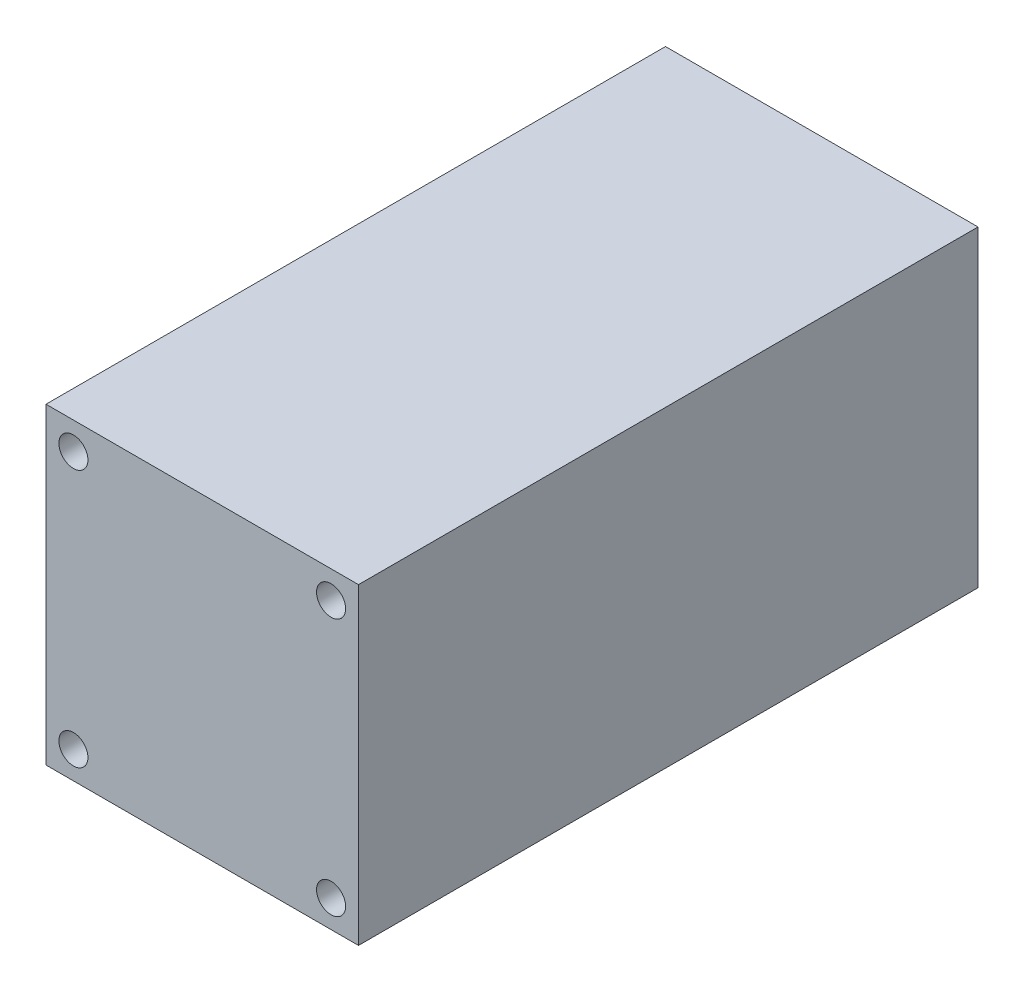
ISO-10303-21;
HEADER;
FILE_DESCRIPTION(('STEP AP214'),'2;1');
FILE_NAME('part.step','',(''),(''),'','','');
FILE_SCHEMA(('AUTOMOTIVE_DESIGN { 1 0 10303 214 1 1 1 1 }'));
ENDSEC;
DATA;
#1=APPLICATION_CONTEXT('core data for automotive mechanical design processes');
#2=APPLICATION_PROTOCOL_DEFINITION('international standard','automotive_design',2000,#1);
#3=PRODUCT_CONTEXT('',#1,'mechanical');
#4=PRODUCT('Part','Part','',(#3));
#5=PRODUCT_RELATED_PRODUCT_CATEGORY('part','',(#4));
#6=PRODUCT_DEFINITION_FORMATION('','',#4);
#7=PRODUCT_DEFINITION_CONTEXT('part definition',#1,'design');
#8=PRODUCT_DEFINITION('design','',#6,#7);
#9=PRODUCT_DEFINITION_SHAPE('','',#8);
#10=(LENGTH_UNIT() NAMED_UNIT(*) SI_UNIT(.MILLI.,.METRE.));
#11=(NAMED_UNIT(*) PLANE_ANGLE_UNIT() SI_UNIT($,.RADIAN.));
#12=(NAMED_UNIT(*) SI_UNIT($,.STERADIAN.) SOLID_ANGLE_UNIT());
#13=UNCERTAINTY_MEASURE_WITH_UNIT(LENGTH_MEASURE(1.E-05),#10,'distance_accuracy_value','');
#14=(GEOMETRIC_REPRESENTATION_CONTEXT(3) GLOBAL_UNCERTAINTY_ASSIGNED_CONTEXT((#13)) GLOBAL_UNIT_ASSIGNED_CONTEXT((#10,
#11,#12)) REPRESENTATION_CONTEXT('',''));
#15=CARTESIAN_POINT('',(0.,0.,0.));
#16=DIRECTION('',(0.,0.,1.));
#17=DIRECTION('',(1.,0.,0.));
#18=AXIS2_PLACEMENT_3D('',#15,#16,#17);
#19=CARTESIAN_POINT('',(0.,0.,113.));
#20=DIRECTION('',(0.,0.,-1.));
#21=DIRECTION('',(-1.,0.,0.));
#22=AXIS2_PLACEMENT_3D('',#19,#20,#21);
#23=PLANE('',#22);
#24=CARTESIAN_POINT('',(23.5,-23.5,113.));
#25=DIRECTION('',(0.,0.,1.));
#26=DIRECTION('',(1.,0.,0.));
#27=AXIS2_PLACEMENT_3D('',#24,#25,#26);
#28=CIRCLE('',#27,2.65);
#29=CARTESIAN_POINT('',(26.15,-23.5,113.));
#30=VERTEX_POINT('',#29);
#31=EDGE_CURVE('E134',#30,#30,#28,.T.);
#32=ORIENTED_EDGE('',*,*,#31,.F.);
#33=EDGE_LOOP('',(#32));
#34=FACE_BOUND('',#33,.T.);
#35=CARTESIAN_POINT('',(-23.5,23.5,113.));
#36=DIRECTION('',(0.,0.,1.));
#37=DIRECTION('',(1.,0.,0.));
#38=AXIS2_PLACEMENT_3D('',#35,#36,#37);
#39=CIRCLE('',#38,2.65);
#40=CARTESIAN_POINT('',(-20.85,23.5,113.));
#41=VERTEX_POINT('',#40);
#42=EDGE_CURVE('E103',#41,#41,#39,.T.);
#43=ORIENTED_EDGE('',*,*,#42,.F.);
#44=EDGE_LOOP('',(#43));
#45=FACE_BOUND('',#44,.T.);
#46=DIRECTION('',(0.,1.,0.));
#47=VECTOR('',#46,1.);
#48=CARTESIAN_POINT('',(28.5,-28.5,113.));
#49=LINE('',#48,#47);
#50=CARTESIAN_POINT('',(28.5,-28.5,113.));
#51=VERTEX_POINT('',#50);
#52=CARTESIAN_POINT('',(28.5,28.5,113.));
#53=VERTEX_POINT('',#52);
#54=EDGE_CURVE('E86',#51,#53,#49,.T.);
#55=ORIENTED_EDGE('',*,*,#54,.T.);
#56=DIRECTION('',(-1.,0.,0.));
#57=VECTOR('',#56,1.);
#58=CARTESIAN_POINT('',(-28.5,28.5,113.));
#59=LINE('',#58,#57);
#60=CARTESIAN_POINT('',(-28.5,28.5,113.));
#61=VERTEX_POINT('',#60);
#62=EDGE_CURVE('E81',#53,#61,#59,.T.);
#63=ORIENTED_EDGE('',*,*,#62,.T.);
#64=DIRECTION('',(0.,-1.,0.));
#65=VECTOR('',#64,1.);
#66=CARTESIAN_POINT('',(-28.5,-28.5,113.));
#67=LINE('',#66,#65);
#68=CARTESIAN_POINT('',(-28.5,-28.5,113.));
#69=VERTEX_POINT('',#68);
#70=EDGE_CURVE('E84',#61,#69,#67,.T.);
#71=ORIENTED_EDGE('',*,*,#70,.T.);
#72=DIRECTION('',(1.,0.,0.));
#73=VECTOR('',#72,1.);
#74=CARTESIAN_POINT('',(-28.5,-28.5,113.));
#75=LINE('',#74,#73);
#76=EDGE_CURVE('E50',#69,#51,#75,.T.);
#77=ORIENTED_EDGE('',*,*,#76,.T.);
#78=EDGE_LOOP('',(#55,#63,#71,#77));
#79=FACE_BOUND('',#78,.T.);
#80=CARTESIAN_POINT('',(23.5,23.5,113.));
#81=DIRECTION('',(0.,0.,1.));
#82=DIRECTION('',(1.,0.,0.));
#83=AXIS2_PLACEMENT_3D('',#80,#81,#82);
#84=CIRCLE('',#83,2.65);
#85=CARTESIAN_POINT('',(26.15,23.5,113.));
#86=VERTEX_POINT('',#85);
#87=EDGE_CURVE('E139',#86,#86,#84,.T.);
#88=ORIENTED_EDGE('',*,*,#87,.F.);
#89=EDGE_LOOP('',(#88));
#90=FACE_BOUND('',#89,.T.);
#91=CARTESIAN_POINT('',(-23.5,-23.5,113.));
#92=DIRECTION('',(0.,0.,1.));
#93=DIRECTION('',(1.,0.,0.));
#94=AXIS2_PLACEMENT_3D('',#91,#92,#93);
#95=CIRCLE('',#94,2.65);
#96=CARTESIAN_POINT('',(-20.85,-23.5,113.));
#97=VERTEX_POINT('',#96);
#98=EDGE_CURVE('E125',#97,#97,#95,.T.);
#99=ORIENTED_EDGE('',*,*,#98,.F.);
#100=EDGE_LOOP('',(#99));
#101=FACE_BOUND('',#100,.T.);
#102=ADVANCED_FACE('F32',(#34,#45,#79,#90,#101),#23,.F.);
#103=CARTESIAN_POINT('',(0.,0.,0.));
#104=DIRECTION('',(0.,0.,-1.));
#105=DIRECTION('',(-1.,0.,0.));
#106=AXIS2_PLACEMENT_3D('',#103,#104,#105);
#107=PLANE('',#106);
#108=CARTESIAN_POINT('',(0.,0.,0.));
#109=DIRECTION('',(0.,0.,-1.));
#110=DIRECTION('',(-1.,0.,0.));
#111=AXIS2_PLACEMENT_3D('',#108,#109,#110);
#112=CIRCLE('',#111,19.075);
#113=CARTESIAN_POINT('',(-19.075,0.,0.));
#114=VERTEX_POINT('',#113);
#115=EDGE_CURVE('E11',#114,#114,#112,.T.);
#116=ORIENTED_EDGE('',*,*,#115,.F.);
#117=EDGE_LOOP('',(#116));
#118=FACE_BOUND('',#117,.T.);
#119=CARTESIAN_POINT('',(23.5,-23.5,0.));
#120=DIRECTION('',(0.,0.,1.));
#121=DIRECTION('',(1.,0.,0.));
#122=AXIS2_PLACEMENT_3D('',#119,#120,#121);
#123=CIRCLE('',#122,2.65);
#124=CARTESIAN_POINT('',(26.15,-23.5,0.));
#125=VERTEX_POINT('',#124);
#126=EDGE_CURVE('E129',#125,#125,#123,.T.);
#127=ORIENTED_EDGE('',*,*,#126,.T.);
#128=EDGE_LOOP('',(#127));
#129=FACE_BOUND('',#128,.T.);
#130=CARTESIAN_POINT('',(-23.5,23.5,0.));
#131=DIRECTION('',(0.,0.,1.));
#132=DIRECTION('',(1.,0.,0.));
#133=AXIS2_PLACEMENT_3D('',#130,#131,#132);
#134=CIRCLE('',#133,2.65);
#135=CARTESIAN_POINT('',(-20.85,23.5,0.));
#136=VERTEX_POINT('',#135);
#137=EDGE_CURVE('E142',#136,#136,#134,.T.);
#138=ORIENTED_EDGE('',*,*,#137,.T.);
#139=EDGE_LOOP('',(#138));
#140=FACE_BOUND('',#139,.T.);
#141=DIRECTION('',(0.,1.,0.));
#142=VECTOR('',#141,1.);
#143=CARTESIAN_POINT('',(28.5,-28.5,0.));
#144=LINE('',#143,#142);
#145=CARTESIAN_POINT('',(28.5,-28.5,0.));
#146=VERTEX_POINT('',#145);
#147=CARTESIAN_POINT('',(28.5,28.5,0.));
#148=VERTEX_POINT('',#147);
#149=EDGE_CURVE('E100',#146,#148,#144,.T.);
#150=ORIENTED_EDGE('',*,*,#149,.F.);
#151=DIRECTION('',(1.,0.,0.));
#152=VECTOR('',#151,1.);
#153=CARTESIAN_POINT('',(-28.5,-28.5,0.));
#154=LINE('',#153,#152);
#155=CARTESIAN_POINT('',(-28.5,-28.5,0.));
#156=VERTEX_POINT('',#155);
#157=EDGE_CURVE('E73',#156,#146,#154,.T.);
#158=ORIENTED_EDGE('',*,*,#157,.F.);
#159=DIRECTION('',(0.,-1.,0.));
#160=VECTOR('',#159,1.);
#161=CARTESIAN_POINT('',(-28.5,-28.5,0.));
#162=LINE('',#161,#160);
#163=CARTESIAN_POINT('',(-28.5,28.5,0.));
#164=VERTEX_POINT('',#163);
#165=EDGE_CURVE('E67',#164,#156,#162,.T.);
#166=ORIENTED_EDGE('',*,*,#165,.F.);
#167=DIRECTION('',(-1.,0.,0.));
#168=VECTOR('',#167,1.);
#169=CARTESIAN_POINT('',(-28.5,28.5,0.));
#170=LINE('',#169,#168);
#171=EDGE_CURVE('E91',#148,#164,#170,.T.);
#172=ORIENTED_EDGE('',*,*,#171,.F.);
#173=EDGE_LOOP('',(#150,#158,#166,#172));
#174=FACE_BOUND('',#173,.T.);
#175=CARTESIAN_POINT('',(23.5,23.5,0.));
#176=DIRECTION('',(0.,0.,1.));
#177=DIRECTION('',(1.,0.,0.));
#178=AXIS2_PLACEMENT_3D('',#175,#176,#177);
#179=CIRCLE('',#178,2.65);
#180=CARTESIAN_POINT('',(26.15,23.5,0.));
#181=VERTEX_POINT('',#180);
#182=EDGE_CURVE('E120',#181,#181,#179,.T.);
#183=ORIENTED_EDGE('',*,*,#182,.T.);
#184=EDGE_LOOP('',(#183));
#185=FACE_BOUND('',#184,.T.);
#186=CARTESIAN_POINT('',(-23.5,-23.5,0.));
#187=DIRECTION('',(0.,0.,1.));
#188=DIRECTION('',(1.,0.,0.));
#189=AXIS2_PLACEMENT_3D('',#186,#187,#188);
#190=CIRCLE('',#189,2.65);
#191=CARTESIAN_POINT('',(-20.85,-23.5,0.));
#192=VERTEX_POINT('',#191);
#193=EDGE_CURVE('E123',#192,#192,#190,.T.);
#194=ORIENTED_EDGE('',*,*,#193,.T.);
#195=EDGE_LOOP('',(#194));
#196=FACE_BOUND('',#195,.T.);
#197=ADVANCED_FACE('F112',(#118,#129,#140,#174,#185,#196),#107,.T.);
#198=CARTESIAN_POINT('',(28.5,-28.5,113.));
#199=DIRECTION('',(-1.,0.,0.));
#200=DIRECTION('',(0.,0.,1.));
#201=AXIS2_PLACEMENT_3D('',#198,#199,#200);
#202=PLANE('',#201);
#203=ORIENTED_EDGE('',*,*,#149,.T.);
#204=DIRECTION('',(0.,0.,-1.));
#205=VECTOR('',#204,1.);
#206=CARTESIAN_POINT('',(28.5,28.5,113.));
#207=LINE('',#206,#205);
#208=EDGE_CURVE('E42',#53,#148,#207,.T.);
#209=ORIENTED_EDGE('',*,*,#208,.F.);
#210=ORIENTED_EDGE('',*,*,#54,.F.);
#211=DIRECTION('',(0.,0.,-1.));
#212=VECTOR('',#211,1.);
#213=CARTESIAN_POINT('',(28.5,-28.5,113.));
#214=LINE('',#213,#212);
#215=EDGE_CURVE('E96',#51,#146,#214,.T.);
#216=ORIENTED_EDGE('',*,*,#215,.T.);
#217=EDGE_LOOP('',(#203,#209,#210,#216));
#218=FACE_BOUND('',#217,.T.);
#219=ADVANCED_FACE('F34',(#218),#202,.F.);
#220=CARTESIAN_POINT('',(-28.5,28.5,113.));
#221=DIRECTION('',(0.,-1.,0.));
#222=DIRECTION('',(0.,0.,-1.));
#223=AXIS2_PLACEMENT_3D('',#220,#221,#222);
#224=PLANE('',#223);
#225=ORIENTED_EDGE('',*,*,#171,.T.);
#226=DIRECTION('',(0.,0.,-1.));
#227=VECTOR('',#226,1.);
#228=CARTESIAN_POINT('',(-28.5,28.5,113.));
#229=LINE('',#228,#227);
#230=EDGE_CURVE('E89',#61,#164,#229,.T.);
#231=ORIENTED_EDGE('',*,*,#230,.F.);
#232=ORIENTED_EDGE('',*,*,#62,.F.);
#233=ORIENTED_EDGE('',*,*,#208,.T.);
#234=EDGE_LOOP('',(#225,#231,#232,#233));
#235=FACE_BOUND('',#234,.T.);
#236=ADVANCED_FACE('F90',(#235),#224,.F.);
#237=CARTESIAN_POINT('',(-28.5,-28.5,113.));
#238=DIRECTION('',(1.,0.,0.));
#239=DIRECTION('',(0.,0.,-1.));
#240=AXIS2_PLACEMENT_3D('',#237,#238,#239);
#241=PLANE('',#240);
#242=ORIENTED_EDGE('',*,*,#165,.T.);
#243=DIRECTION('',(0.,0.,-1.));
#244=VECTOR('',#243,1.);
#245=CARTESIAN_POINT('',(-28.5,-28.5,113.));
#246=LINE('',#245,#244);
#247=EDGE_CURVE('E92',#69,#156,#246,.T.);
#248=ORIENTED_EDGE('',*,*,#247,.F.);
#249=ORIENTED_EDGE('',*,*,#70,.F.);
#250=ORIENTED_EDGE('',*,*,#230,.T.);
#251=EDGE_LOOP('',(#242,#248,#249,#250));
#252=FACE_BOUND('',#251,.T.);
#253=ADVANCED_FACE('F94',(#252),#241,.F.);
#254=CARTESIAN_POINT('',(-28.5,-28.5,113.));
#255=DIRECTION('',(0.,1.,0.));
#256=DIRECTION('',(0.,0.,1.));
#257=AXIS2_PLACEMENT_3D('',#254,#255,#256);
#258=PLANE('',#257);
#259=ORIENTED_EDGE('',*,*,#157,.T.);
#260=ORIENTED_EDGE('',*,*,#215,.F.);
#261=ORIENTED_EDGE('',*,*,#76,.F.);
#262=ORIENTED_EDGE('',*,*,#247,.T.);
#263=EDGE_LOOP('',(#259,#260,#261,#262));
#264=FACE_BOUND('',#263,.T.);
#265=ADVANCED_FACE('F153',(#264),#258,.F.);
#266=CARTESIAN_POINT('',(-23.5,23.5,113.));
#267=DIRECTION('',(0.,0.,-1.));
#268=DIRECTION('',(-1.,0.,0.));
#269=AXIS2_PLACEMENT_3D('',#266,#267,#268);
#270=CYLINDRICAL_SURFACE('',#269,2.65);
#271=ORIENTED_EDGE('',*,*,#42,.T.);
#272=EDGE_LOOP('',(#271));
#273=FACE_BOUND('',#272,.T.);
#274=ORIENTED_EDGE('',*,*,#137,.F.);
#275=EDGE_LOOP('',(#274));
#276=FACE_BOUND('',#275,.T.);
#277=ADVANCED_FACE('F150',(#273,#276),#270,.F.);
#278=CARTESIAN_POINT('',(23.5,23.5,113.));
#279=DIRECTION('',(0.,0.,-1.));
#280=DIRECTION('',(-1.,0.,0.));
#281=AXIS2_PLACEMENT_3D('',#278,#279,#280);
#282=CYLINDRICAL_SURFACE('',#281,2.65);
#283=ORIENTED_EDGE('',*,*,#87,.T.);
#284=EDGE_LOOP('',(#283));
#285=FACE_BOUND('',#284,.T.);
#286=ORIENTED_EDGE('',*,*,#182,.F.);
#287=EDGE_LOOP('',(#286));
#288=FACE_BOUND('',#287,.T.);
#289=ADVANCED_FACE('F152',(#285,#288),#282,.F.);
#290=CARTESIAN_POINT('',(23.5,-23.5,113.));
#291=DIRECTION('',(0.,0.,-1.));
#292=DIRECTION('',(-1.,0.,0.));
#293=AXIS2_PLACEMENT_3D('',#290,#291,#292);
#294=CYLINDRICAL_SURFACE('',#293,2.65);
#295=ORIENTED_EDGE('',*,*,#31,.T.);
#296=EDGE_LOOP('',(#295));
#297=FACE_BOUND('',#296,.T.);
#298=ORIENTED_EDGE('',*,*,#126,.F.);
#299=EDGE_LOOP('',(#298));
#300=FACE_BOUND('',#299,.T.);
#301=ADVANCED_FACE('F160',(#297,#300),#294,.F.);
#302=CARTESIAN_POINT('',(-23.5,-23.5,113.));
#303=DIRECTION('',(0.,0.,-1.));
#304=DIRECTION('',(-1.,0.,0.));
#305=AXIS2_PLACEMENT_3D('',#302,#303,#304);
#306=CYLINDRICAL_SURFACE('',#305,2.65);
#307=ORIENTED_EDGE('',*,*,#98,.T.);
#308=EDGE_LOOP('',(#307));
#309=FACE_BOUND('',#308,.T.);
#310=ORIENTED_EDGE('',*,*,#193,.F.);
#311=EDGE_LOOP('',(#310));
#312=FACE_BOUND('',#311,.T.);
#313=ADVANCED_FACE('F190',(#309,#312),#306,.F.);
#314=CARTESIAN_POINT('',(0.,0.,-1.6));
#315=DIRECTION('',(0.,0.,1.));
#316=DIRECTION('',(1.,0.,0.));
#317=AXIS2_PLACEMENT_3D('',#314,#315,#316);
#318=CYLINDRICAL_SURFACE('',#317,19.075);
#319=CARTESIAN_POINT('',(0.,0.,-1.6));
#320=DIRECTION('',(0.,0.,1.));
#321=DIRECTION('',(1.,0.,0.));
#322=AXIS2_PLACEMENT_3D('',#319,#320,#321);
#323=CIRCLE('',#322,19.075);
#324=CARTESIAN_POINT('',(19.075,0.,-1.6));
#325=VERTEX_POINT('',#324);
#326=EDGE_CURVE('E126',#325,#325,#323,.T.);
#327=ORIENTED_EDGE('',*,*,#326,.T.);
#328=EDGE_LOOP('',(#327));
#329=FACE_BOUND('',#328,.T.);
#330=ORIENTED_EDGE('',*,*,#115,.T.);
#331=EDGE_LOOP('',(#330));
#332=FACE_BOUND('',#331,.T.);
#333=ADVANCED_FACE('F195',(#329,#332),#318,.T.);
#334=CARTESIAN_POINT('',(0.,0.,-1.6));
#335=DIRECTION('',(0.,0.,1.));
#336=DIRECTION('',(1.,0.,0.));
#337=AXIS2_PLACEMENT_3D('',#334,#335,#336);
#338=PLANE('',#337);
#339=CARTESIAN_POINT('',(0.,0.,-1.6));
#340=DIRECTION('',(0.,0.,1.));
#341=DIRECTION('',(1.,0.,0.));
#342=AXIS2_PLACEMENT_3D('',#339,#340,#341);
#343=CIRCLE('',#342,5.);
#344=CARTESIAN_POINT('',(5.,0.,-1.6));
#345=VERTEX_POINT('',#344);
#346=EDGE_CURVE('E36',#345,#345,#343,.T.);
#347=ORIENTED_EDGE('',*,*,#346,.T.);
#348=EDGE_LOOP('',(#347));
#349=FACE_BOUND('',#348,.T.);
#350=ORIENTED_EDGE('',*,*,#326,.F.);
#351=EDGE_LOOP('',(#350));
#352=FACE_BOUND('',#351,.T.);
#353=ADVANCED_FACE('F200',(#349,#352),#338,.F.);
#354=CARTESIAN_POINT('',(0.,0.,-22.4));
#355=DIRECTION('',(0.,0.,1.));
#356=DIRECTION('',(1.,0.,0.));
#357=AXIS2_PLACEMENT_3D('',#354,#355,#356);
#358=CYLINDRICAL_SURFACE('',#357,5.);
#359=CARTESIAN_POINT('',(0.,0.,-22.4));
#360=DIRECTION('',(0.,0.,1.));
#361=DIRECTION('',(1.,0.,0.));
#362=AXIS2_PLACEMENT_3D('',#359,#360,#361);
#363=CIRCLE('',#362,5.);
#364=CARTESIAN_POINT('',(5.,0.,-22.4));
#365=VERTEX_POINT('',#364);
#366=EDGE_CURVE('E282',#365,#365,#363,.T.);
#367=ORIENTED_EDGE('',*,*,#366,.T.);
#368=EDGE_LOOP('',(#367));
#369=FACE_BOUND('',#368,.T.);
#370=ORIENTED_EDGE('',*,*,#346,.F.);
#371=EDGE_LOOP('',(#370));
#372=FACE_BOUND('',#371,.T.);
#373=ADVANCED_FACE('F210',(#369,#372),#358,.T.);
#374=CARTESIAN_POINT('',(0.,0.,-22.4));
#375=DIRECTION('',(0.,0.,1.));
#376=DIRECTION('',(1.,0.,0.));
#377=AXIS2_PLACEMENT_3D('',#374,#375,#376);
#378=PLANE('',#377);
#379=ORIENTED_EDGE('',*,*,#366,.F.);
#380=EDGE_LOOP('',(#379));
#381=FACE_BOUND('',#380,.T.);
#382=ADVANCED_FACE('F220',(#381),#378,.F.);
#383=CLOSED_SHELL('',(#102,#197,#219,#236,#253,#265,#277,#289,#301,#313,#333,#353,#373,#382));
#384=MANIFOLD_SOLID_BREP('B2',#383);
#385=ADVANCED_BREP_SHAPE_REPRESENTATION('',(#18,#384),#14);
#386=SHAPE_DEFINITION_REPRESENTATION(#9,#385);
ENDSEC;
END-ISO-10303-21;
